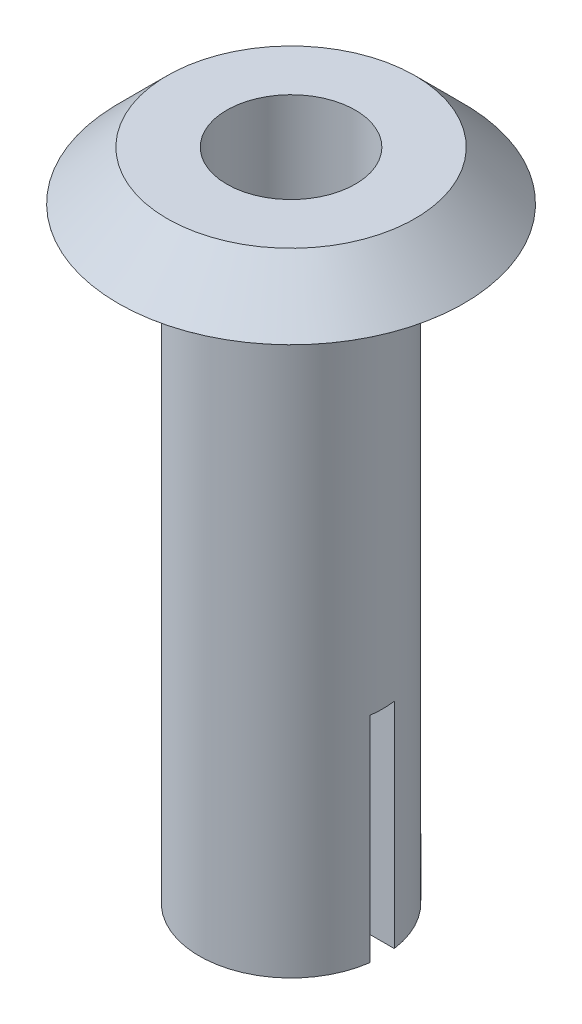
ISO-10303-21;
HEADER;
FILE_DESCRIPTION(('STEP AP214'),'2;1');
FILE_NAME('part.step','',(''),(''),'','','');
FILE_SCHEMA(('AUTOMOTIVE_DESIGN { 1 0 10303 214 1 1 1 1 }'));
ENDSEC;
DATA;
#1=APPLICATION_CONTEXT('core data for automotive mechanical design processes');
#2=APPLICATION_PROTOCOL_DEFINITION('international standard','automotive_design',2000,#1);
#3=PRODUCT_CONTEXT('',#1,'mechanical');
#4=PRODUCT('Part','Part','',(#3));
#5=PRODUCT_RELATED_PRODUCT_CATEGORY('part','',(#4));
#6=PRODUCT_DEFINITION_FORMATION('','',#4);
#7=PRODUCT_DEFINITION_CONTEXT('part definition',#1,'design');
#8=PRODUCT_DEFINITION('design','',#6,#7);
#9=PRODUCT_DEFINITION_SHAPE('','',#8);
#10=(LENGTH_UNIT() NAMED_UNIT(*) SI_UNIT(.MILLI.,.METRE.));
#11=(NAMED_UNIT(*) PLANE_ANGLE_UNIT() SI_UNIT($,.RADIAN.));
#12=(NAMED_UNIT(*) SI_UNIT($,.STERADIAN.) SOLID_ANGLE_UNIT());
#13=UNCERTAINTY_MEASURE_WITH_UNIT(LENGTH_MEASURE(1.E-05),#10,'distance_accuracy_value','');
#14=(GEOMETRIC_REPRESENTATION_CONTEXT(3) GLOBAL_UNCERTAINTY_ASSIGNED_CONTEXT((#13)) GLOBAL_UNIT_ASSIGNED_CONTEXT((#10,
#11,#12)) REPRESENTATION_CONTEXT('',''));
#15=CARTESIAN_POINT('',(0.,0.,0.));
#16=DIRECTION('',(0.,0.,1.));
#17=DIRECTION('',(1.,0.,0.));
#18=AXIS2_PLACEMENT_3D('',#15,#16,#17);
#19=CARTESIAN_POINT('',(0.,0.,0.));
#20=DIRECTION('',(0.,1.,0.));
#21=DIRECTION('',(0.,0.,1.));
#22=AXIS2_PLACEMENT_3D('',#19,#20,#21);
#23=PLANE('',#22);
#24=CARTESIAN_POINT('',(0.,0.,0.));
#25=DIRECTION('',(0.,1.,0.));
#26=DIRECTION('',(0.,0.,1.));
#27=AXIS2_PLACEMENT_3D('',#24,#25,#26);
#28=CIRCLE('',#27,1.5);
#29=CARTESIAN_POINT('',(1.48660687473185,0.,-0.2));
#30=VERTEX_POINT('',#29);
#31=CARTESIAN_POINT('',(-1.48660687473185,0.,-0.2));
#32=VERTEX_POINT('',#31);
#33=EDGE_CURVE('E128',#30,#32,#28,.T.);
#34=ORIENTED_EDGE('',*,*,#33,.F.);
#35=DIRECTION('',(1.,0.,0.));
#36=VECTOR('',#35,1.);
#37=CARTESIAN_POINT('',(-1.5,0.,-0.2));
#38=LINE('',#37,#36);
#39=EDGE_CURVE('E115',#32,#30,#38,.T.);
#40=ORIENTED_EDGE('',*,*,#39,.F.);
#41=EDGE_LOOP('',(#34,#40));
#42=FACE_BOUND('',#41,.T.);
#43=ADVANCED_FACE('F32',(#42),#23,.F.);
#44=CARTESIAN_POINT('',(0.,0.300099999999999,0.));
#45=DIRECTION('',(0.,1.,0.));
#46=DIRECTION('',(0.,0.,1.));
#47=AXIS2_PLACEMENT_3D('',#44,#45,#46);
#48=PLANE('',#47);
#49=DIRECTION('',(-1.,0.,0.));
#50=VECTOR('',#49,1.);
#51=CARTESIAN_POINT('',(0.,0.300099999999999,-0.2));
#52=LINE('',#51,#50);
#53=CARTESIAN_POINT('',(0.15,0.300099999999999,-0.2));
#54=VERTEX_POINT('',#53);
#55=CARTESIAN_POINT('',(-0.150000000000001,0.300099999999986,-0.2));
#56=VERTEX_POINT('',#55);
#57=EDGE_CURVE('E125',#54,#56,#52,.T.);
#58=ORIENTED_EDGE('',*,*,#57,.F.);
#59=CARTESIAN_POINT('',(0.,0.300099999999999,0.));
#60=DIRECTION('',(0.,1.,0.));
#61=DIRECTION('',(0.,0.,1.));
#62=AXIS2_PLACEMENT_3D('',#59,#60,#61);
#63=CIRCLE('',#62,0.25);
#64=EDGE_CURVE('E149',#54,#56,#63,.T.);
#65=ORIENTED_EDGE('',*,*,#64,.T.);
#66=EDGE_LOOP('',(#58,#65));
#67=FACE_BOUND('',#66,.T.);
#68=ADVANCED_FACE('F174',(#67),#48,.T.);
#69=CARTESIAN_POINT('',(0.,1.1001,0.));
#70=DIRECTION('',(0.,1.,0.));
#71=DIRECTION('',(0.,0.,1.));
#72=AXIS2_PLACEMENT_3D('',#69,#70,#71);
#73=DEGENERATE_TOROIDAL_SURFACE('',#72,0.25,0.8,.T.);
#74=ORIENTED_EDGE('',*,*,#64,.F.);
#75=CARTESIAN_POINT('',(0.,0.301664028866421,-0.2));
#76=CARTESIAN_POINT('',(0.0166698415826688,0.301665716670462,-0.2));
#77=CARTESIAN_POINT('',(0.0333398856129194,0.3015243846989,-0.2));
#78=CARTESIAN_POINT('',(0.0666781693266342,0.30108013124724,-0.2));
#79=CARTESIAN_POINT('',(0.0833464085193591,0.300777189443076,-0.2));
#80=CARTESIAN_POINT('',(0.1334092614839,0.300050609114223,-0.2));
#81=CARTESIAN_POINT('',(0.166812993914217,0.299810645876321,-0.2));
#82=CARTESIAN_POINT('',(0.229406412635807,0.301628464075076,-0.2));
#83=CARTESIAN_POINT('',(0.258601027229079,0.303402834124199,-0.2));
#84=CARTESIAN_POINT('',(0.316743266893158,0.309438387928073,-0.2));
#85=CARTESIAN_POINT('',(0.345690900061749,0.313699489829914,-0.2));
#86=CARTESIAN_POINT('',(0.402991969738191,0.324990979910246,-0.2));
#87=CARTESIAN_POINT('',(0.43134645596889,0.332015945335915,-0.2));
#88=CARTESIAN_POINT('',(0.487189985294854,0.348926444225662,-0.2));
#89=CARTESIAN_POINT('',(0.51467891698504,0.358812344263913,-0.2));
#90=CARTESIAN_POINT('',(0.583350982841369,0.387704578778115,-0.2));
#91=CARTESIAN_POINT('',(0.623707050723279,0.408732010133996,-0.2));
#92=CARTESIAN_POINT('',(0.70034544039585,0.457286962317908,-0.2));
#93=CARTESIAN_POINT('',(0.736623667136238,0.484820932590386,-0.2));
#94=CARTESIAN_POINT('',(0.803997133913799,0.54568309567333,-0.2));
#95=CARTESIAN_POINT('',(0.835088877571679,0.579015166498633,-0.2));
#96=CARTESIAN_POINT('',(0.891088036855366,0.650499827033321,-0.2));
#97=CARTESIAN_POINT('',(0.91599833710029,0.688650155675189,-0.2));
#98=CARTESIAN_POINT('',(0.958481280077041,0.767903473247014,-0.2));
#99=CARTESIAN_POINT('',(0.976184281869383,0.808936633314383,-0.2));
#100=CARTESIAN_POINT('',(1.00439993048064,0.893409146125019,-0.2));
#101=CARTESIAN_POINT('',(1.01491219899784,0.936848625333877,-0.2));
#102=CARTESIAN_POINT('',(1.02838751393651,1.02458296266082,-0.2));
#103=CARTESIAN_POINT('',(1.03140084062819,1.06887010627033,-0.2));
#104=CARTESIAN_POINT('',(1.02993685654376,1.15732453651702,-0.2));
#105=CARTESIAN_POINT('',(1.02545891825336,1.20149181280298,-0.2));
#106=CARTESIAN_POINT('',(1.00915342271604,1.28838340979925,-0.2));
#107=CARTESIAN_POINT('',(0.997336178055473,1.3311096666496,-0.2));
#108=CARTESIAN_POINT('',(0.96671324204589,1.41395512181443,-0.2));
#109=CARTESIAN_POINT('',(0.94791096556733,1.4540755828194,-0.2));
#110=CARTESIAN_POINT('',(0.903839144046234,1.5306506914578,-0.2));
#111=CARTESIAN_POINT('',(0.878562317198208,1.56710114677823,-0.2));
#112=CARTESIAN_POINT('',(0.822245470323173,1.63532842733279,-0.2));
#113=CARTESIAN_POINT('',(0.791196792082228,1.66709810098076,-0.2));
#114=CARTESIAN_POINT('',(0.724008067566469,1.72527142435174,-0.2));
#115=CARTESIAN_POINT('',(0.687830871368458,1.75163214192628,-0.2));
#116=CARTESIAN_POINT('',(0.611776285106589,1.7979354345787,-0.2));
#117=CARTESIAN_POINT('',(0.571913327608463,1.81790178231344,-0.2));
#118=CARTESIAN_POINT('',(0.488698905847722,1.85152795161462,-0.2));
#119=CARTESIAN_POINT('',(0.445293861557957,1.86505457212068,-0.2));
#120=CARTESIAN_POINT('',(0.356717442684082,1.88530811915976,-0.2));
#121=CARTESIAN_POINT('',(0.311537986720364,1.89199895064935,-0.2));
#122=CARTESIAN_POINT('',(0.243810832825528,1.89765746387715,-0.2));
#123=CARTESIAN_POINT('',(0.221405555467714,1.89882104800239,-0.2));
#124=CARTESIAN_POINT('',(0.176559166379535,1.90008848768721,-0.2));
#125=CARTESIAN_POINT('',(0.154118045261469,1.90019199329407,-0.2));
#126=CARTESIAN_POINT('',(0.109196727516647,1.89986873007227,-0.2));
#127=CARTESIAN_POINT('',(0.0867165534580952,1.89944079485711,-0.2));
#128=CARTESIAN_POINT('',(0.0417602725450973,1.89876428051567,-0.2));
#129=CARTESIAN_POINT('',(0.019284167584967,1.89851563069695,-0.2));
#130=CARTESIAN_POINT('',(-0.025660278519589,1.8985594930865,-0.2));
#131=CARTESIAN_POINT('',(-0.0481286199316124,1.89885183940198,-0.2));
#132=CARTESIAN_POINT('',(-0.0930716344119246,1.89955118293042,-0.2));
#133=CARTESIAN_POINT('',(-0.115546306170629,1.89995822829499,-0.2));
#134=CARTESIAN_POINT('',(-0.160455392283716,1.90018035007007,-0.2));
#135=CARTESIAN_POINT('',(-0.182889787694872,1.89999671397185,-0.2));
#136=CARTESIAN_POINT('',(-0.227717260508836,1.89852636404797,-0.2));
#137=CARTESIAN_POINT('',(-0.250110352920595,1.89724019939141,-0.2));
#138=CARTESIAN_POINT('',(-0.296297968778292,1.89312072295697,-0.2));
#139=CARTESIAN_POINT('',(-0.320084183523527,1.89018810205309,-0.2));
#140=CARTESIAN_POINT('',(-0.367381071661445,1.88251258442502,-0.2));
#141=CARTESIAN_POINT('',(-0.390891486534653,1.87776811045488,-0.2));
#142=CARTESIAN_POINT('',(-0.460460798783883,1.86072186606951,-0.2));
#143=CARTESIAN_POINT('',(-0.50586933742622,1.84558316011647,-0.2));
#144=CARTESIAN_POINT('',(-0.593621321286191,1.80758337797835,-0.2));
#145=CARTESIAN_POINT('',(-0.635946841713136,1.78468093791962,-0.2));
#146=CARTESIAN_POINT('',(-0.716023573084661,1.73160345969393,-0.2));
#147=CARTESIAN_POINT('',(-0.753756166231605,1.70140021266384,-0.2));
#148=CARTESIAN_POINT('',(-0.82122693284102,1.63652498131007,-0.2));
#149=CARTESIAN_POINT('',(-0.85129133705298,1.60219152148355,-0.2));
#150=CARTESIAN_POINT('',(-0.905034875406046,1.52893181931438,-0.2));
#151=CARTESIAN_POINT('',(-0.928725093673388,1.49001372097015,-0.2));
#152=CARTESIAN_POINT('',(-0.968651849943626,1.40950280684566,-0.2));
#153=CARTESIAN_POINT('',(-0.985028556964881,1.3679794247673,-0.2));
#154=CARTESIAN_POINT('',(-1.01053977879569,1.28274183353331,-0.2));
#155=CARTESIAN_POINT('',(-1.01967100083736,1.23902663787444,-0.2));
#156=CARTESIAN_POINT('',(-1.03037488252278,1.15095439400306,-0.2));
#157=CARTESIAN_POINT('',(-1.0319936625118,1.10660294352136,-0.2));
#158=CARTESIAN_POINT('',(-1.02775164201873,1.01826517229983,-0.2));
#159=CARTESIAN_POINT('',(-1.0218918980028,0.974278800869947,-0.2));
#160=CARTESIAN_POINT('',(-1.00287715257568,0.887968733763957,-0.2));
#161=CARTESIAN_POINT('',(-0.989730984078273,0.845643091273803,-0.2));
#162=CARTESIAN_POINT('',(-0.956532739392012,0.763794250976399,-0.2));
#163=CARTESIAN_POINT('',(-0.936480727484413,0.724271027087691,-0.2));
#164=CARTESIAN_POINT('',(-0.89000930653147,0.64906071693307,-0.2));
#165=CARTESIAN_POINT('',(-0.863577783044371,0.613381118268823,-0.2));
#166=CARTESIAN_POINT('',(-0.805135950061446,0.546924767249335,-0.2));
#167=CARTESIAN_POINT('',(-0.773124960237336,0.516148613669176,-0.2));
#168=CARTESIAN_POINT('',(-0.704201964591778,0.460112519291118,-0.2));
#169=CARTESIAN_POINT('',(-0.667255690928788,0.434894751164043,-0.2));
#170=CARTESIAN_POINT('',(-0.589750741014979,0.390878049049808,-0.2));
#171=CARTESIAN_POINT('',(-0.54919335423805,0.372076835306597,-0.2));
#172=CARTESIAN_POINT('',(-0.464618124035503,0.340825065662164,-0.2));
#173=CARTESIAN_POINT('',(-0.420541481173459,0.328533559765889,-0.2));
#174=CARTESIAN_POINT('',(-0.353478204694672,0.315193747108826,-0.2));
#175=CARTESIAN_POINT('',(-0.330958738023759,0.31159639946551,-0.2));
#176=CARTESIAN_POINT('',(-0.285725184481576,0.305962984516719,-0.2));
#177=CARTESIAN_POINT('',(-0.263011112275252,0.303926800594549,-0.2));
#178=CARTESIAN_POINT('',(-0.220265046414644,0.301347040853376,-0.2));
#179=CARTESIAN_POINT('',(-0.200241187409336,0.300652632368691,-0.2));
#180=CARTESIAN_POINT('',(-0.160181956336416,0.300008909417066,-0.2));
#181=CARTESIAN_POINT('',(-0.140146582936294,0.300059714626491,-0.2));
#182=CARTESIAN_POINT('',(-0.100092386262173,0.300488954065012,-0.2));
#183=CARTESIAN_POINT('',(-0.0800735597774633,0.300867219654249,-0.2));
#184=CARTESIAN_POINT('',(-0.040036585659352,0.301453725364676,-0.2));
#185=CARTESIAN_POINT('',(-0.0200184388052064,0.301662002020409,-0.2));
#186=CARTESIAN_POINT('',(0.,0.301664028866421,-0.2));
#187=B_SPLINE_CURVE_WITH_KNOTS('',3,(#75,#76,#77,#78,#79,#80,#81,#82,#83,#84,#85,#86,#87,#88,
#89,#90,#91,#92,#93,#94,#95,#96,#97,#98,#99,#100,#101,#102,#103,#104,#105,#106,#107,#108,#109,
#110,#111,#112,#113,#114,#115,#116,#117,#118,#119,#120,#121,#122,#123,#124,#125,#126,#127,#128,
#129,#130,#131,#132,#133,#134,#135,#136,#137,#138,#139,#140,#141,#142,#143,#144,#145,#146,#147,
#148,#149,#150,#151,#152,#153,#154,#155,#156,#157,#158,#159,#160,#161,#162,#163,#164,#165,#166,
#167,#168,#169,#170,#171,#172,#173,#174,#175,#176,#177,#178,#179,#180,#181,#182,#183,#184,#185,
#186),.UNSPECIFIED.,.T.,.F.,(4,2,2,2,2,2,2,2,2,2,2,2,2,2,2,2,2,2,2,2,2,2,2,2,2,2,2,2,2,2,2,2,2,
2,2,2,2,2,2,2,2,2,2,2,2,2,2,2,2,2,2,2,2,2,2,4),(0.,0.0500092875870138,0.100024865829181,
0.200203184706985,0.287861777597849,0.375517485293757,0.463002061677427,0.550497852506859,
0.686345267481207,0.822327906861565,0.958401849368154,1.09441217197756,1.22783965644739,
1.36127415994634,1.49381154741136,1.62636003757694,1.75872270162411,1.8910207406544,
2.02346823117991,2.15611603011066,2.28977910205329,2.42293931893524,2.55874556687355,
2.69526526367023,2.76254952674017,2.82985600094964,2.89731045831805,2.96473830375305,
3.03214547632458,3.09958098925381,3.16686961463669,3.23412474304008,3.3059556878525,
3.37784930567182,3.52070973803225,3.66434359216108,3.80854154820458,3.94478310926737,
4.08078620473341,4.21405728780716,4.34738890234448,4.4799008756818,4.61239413156609,
4.74472712366483,4.87705888400943,5.00964394211279,5.14224517820572,5.27582027582979,
5.40934786564634,5.54600276763964,5.6143717931752,5.68273571114481,5.74282493822376,
5.80292381533889,5.86299176034259,5.92304679195689),.UNSPECIFIED.);
#188=CARTESIAN_POINT('',(1.03077640640442,1.1001,-0.2));
#189=VERTEX_POINT('',#188);
#190=EDGE_CURVE('E250',#54,#189,#187,.T.);
#191=ORIENTED_EDGE('',*,*,#190,.T.);
#192=CARTESIAN_POINT('',(0.,1.1001,0.));
#193=DIRECTION('',(0.,1.,0.));
#194=DIRECTION('',(0.,0.,1.));
#195=AXIS2_PLACEMENT_3D('',#192,#193,#194);
#196=CIRCLE('',#195,1.05);
#197=CARTESIAN_POINT('',(-1.03077640641938,1.10010000000522,-0.2));
#198=VERTEX_POINT('',#197);
#199=EDGE_CURVE('E153',#198,#189,#196,.F.);
#200=ORIENTED_EDGE('',*,*,#199,.F.);
#201=EDGE_CURVE('E159',#198,#56,#187,.T.);
#202=ORIENTED_EDGE('',*,*,#201,.T.);
#203=EDGE_LOOP('',(#74,#191,#200,#202));
#204=FACE_BOUND('',#203,.T.);
#205=ADVANCED_FACE('F194',(#204),#73,.F.);
#206=CARTESIAN_POINT('',(0.,10.7,0.));
#207=DIRECTION('',(0.,-1.,0.));
#208=DIRECTION('',(0.,0.,-1.));
#209=AXIS2_PLACEMENT_3D('',#206,#207,#208);
#210=CYLINDRICAL_SURFACE('',#209,1.5);
#211=CARTESIAN_POINT('',(0.,3.5,0.));
#212=DIRECTION('',(0.,-1.,0.));
#213=DIRECTION('',(0.,0.,-1.));
#214=AXIS2_PLACEMENT_3D('',#211,#212,#213);
#215=CIRCLE('',#214,1.5);
#216=CARTESIAN_POINT('',(1.48660687473185,3.5,-0.2));
#217=VERTEX_POINT('',#216);
#218=CARTESIAN_POINT('',(1.48660687473185,3.5,0.2));
#219=VERTEX_POINT('',#218);
#220=EDGE_CURVE('E212',#217,#219,#215,.T.);
#221=ORIENTED_EDGE('',*,*,#220,.F.);
#222=DIRECTION('',(0.,-1.,0.));
#223=VECTOR('',#222,1.);
#224=CARTESIAN_POINT('',(1.48660687473185,10.7,-0.2));
#225=LINE('',#224,#223);
#226=EDGE_CURVE('E211',#217,#30,#225,.T.);
#227=ORIENTED_EDGE('',*,*,#226,.T.);
#228=ORIENTED_EDGE('',*,*,#33,.T.);
#229=DIRECTION('',(0.,-1.,0.));
#230=VECTOR('',#229,1.);
#231=CARTESIAN_POINT('',(-1.48660687473185,10.7,-0.2));
#232=LINE('',#231,#230);
#233=CARTESIAN_POINT('',(-1.48660687473185,3.5,-0.2));
#234=VERTEX_POINT('',#233);
#235=EDGE_CURVE('E210',#32,#234,#232,.F.);
#236=ORIENTED_EDGE('',*,*,#235,.T.);
#237=CARTESIAN_POINT('',(-1.48660687473185,3.5,0.2));
#238=VERTEX_POINT('',#237);
#239=EDGE_CURVE('E124',#238,#234,#215,.T.);
#240=ORIENTED_EDGE('',*,*,#239,.F.);
#241=DIRECTION('',(0.,-1.,0.));
#242=VECTOR('',#241,1.);
#243=CARTESIAN_POINT('',(-1.48660687473185,10.7,0.2));
#244=LINE('',#243,#242);
#245=CARTESIAN_POINT('',(-1.48660687473185,0.,0.2));
#246=VERTEX_POINT('',#245);
#247=EDGE_CURVE('E110',#238,#246,#244,.T.);
#248=ORIENTED_EDGE('',*,*,#247,.T.);
#249=CARTESIAN_POINT('',(1.48660687473185,0.,0.2));
#250=VERTEX_POINT('',#249);
#251=EDGE_CURVE('E122',#246,#250,#28,.T.);
#252=ORIENTED_EDGE('',*,*,#251,.T.);
#253=DIRECTION('',(0.,-1.,0.));
#254=VECTOR('',#253,1.);
#255=CARTESIAN_POINT('',(1.48660687473185,10.7,0.2));
#256=LINE('',#255,#254);
#257=EDGE_CURVE('E48',#250,#219,#256,.F.);
#258=ORIENTED_EDGE('',*,*,#257,.T.);
#259=EDGE_LOOP('',(#221,#227,#228,#236,#240,#248,#252,#258));
#260=FACE_BOUND('',#259,.T.);
#261=CARTESIAN_POINT('',(0.,9.9,0.));
#262=DIRECTION('',(0.,1.,0.));
#263=DIRECTION('',(0.,0.,1.));
#264=AXIS2_PLACEMENT_3D('',#261,#262,#263);
#265=CIRCLE('',#264,1.5);
#266=CARTESIAN_POINT('',(0.,9.9,1.5));
#267=VERTEX_POINT('',#266);
#268=EDGE_CURVE('E132',#267,#267,#265,.T.);
#269=ORIENTED_EDGE('',*,*,#268,.F.);
#270=EDGE_LOOP('',(#269));
#271=FACE_BOUND('',#270,.T.);
#272=ADVANCED_FACE('F120',(#260,#271),#210,.T.);
#273=ORIENTED_EDGE('',*,*,#251,.F.);
#274=DIRECTION('',(-1.,0.,0.));
#275=VECTOR('',#274,1.);
#276=CARTESIAN_POINT('',(-1.5,0.,0.2));
#277=LINE('',#276,#275);
#278=EDGE_CURVE('E106',#250,#246,#277,.T.);
#279=ORIENTED_EDGE('',*,*,#278,.F.);
#280=EDGE_LOOP('',(#273,#279));
#281=FACE_BOUND('',#280,.T.);
#282=ADVANCED_FACE('F127',(#281),#23,.F.);
#283=CARTESIAN_POINT('',(0.,9.9,0.));
#284=DIRECTION('',(0.,1.,0.));
#285=DIRECTION('',(0.,0.,1.));
#286=AXIS2_PLACEMENT_3D('',#283,#284,#285);
#287=PLANE('',#286);
#288=CARTESIAN_POINT('',(0.,9.9,0.));
#289=DIRECTION('',(0.,1.,0.));
#290=DIRECTION('',(0.,0.,1.));
#291=AXIS2_PLACEMENT_3D('',#288,#289,#290);
#292=CIRCLE('',#291,2.825);
#293=CARTESIAN_POINT('',(0.,9.9,2.825));
#294=VERTEX_POINT('',#293);
#295=EDGE_CURVE('E129',#294,#294,#292,.T.);
#296=ORIENTED_EDGE('',*,*,#295,.F.);
#297=EDGE_LOOP('',(#296));
#298=FACE_BOUND('',#297,.T.);
#299=ORIENTED_EDGE('',*,*,#268,.T.);
#300=EDGE_LOOP('',(#299));
#301=FACE_BOUND('',#300,.T.);
#302=ADVANCED_FACE('F184',(#298,#301),#287,.F.);
#303=CARTESIAN_POINT('',(0.,9.9,0.));
#304=DIRECTION('',(0.,1.,0.));
#305=DIRECTION('',(0.,0.,1.));
#306=AXIS2_PLACEMENT_3D('',#303,#304,#305);
#307=CYLINDRICAL_SURFACE('',#306,2.825);
#308=CARTESIAN_POINT('',(0.,9.90009999999999,0.));
#309=DIRECTION('',(0.,1.,0.));
#310=DIRECTION('',(0.,0.,1.));
#311=AXIS2_PLACEMENT_3D('',#308,#309,#310);
#312=CIRCLE('',#311,2.825);
#313=CARTESIAN_POINT('',(0.,9.90009999999999,2.825));
#314=VERTEX_POINT('',#313);
#315=EDGE_CURVE('E143',#314,#314,#312,.F.);
#316=ORIENTED_EDGE('',*,*,#315,.T.);
#317=EDGE_LOOP('',(#316));
#318=FACE_BOUND('',#317,.T.);
#319=ORIENTED_EDGE('',*,*,#295,.T.);
#320=EDGE_LOOP('',(#319));
#321=FACE_BOUND('',#320,.T.);
#322=ADVANCED_FACE('F182',(#318,#321),#307,.T.);
#323=CARTESIAN_POINT('',(0.,10.7001,0.));
#324=DIRECTION('',(0.,1.,0.));
#325=DIRECTION('',(0.,0.,1.));
#326=AXIS2_PLACEMENT_3D('',#323,#324,#325);
#327=PLANE('',#326);
#328=CARTESIAN_POINT('',(0.,10.7001,0.));
#329=DIRECTION('',(0.,1.,0.));
#330=DIRECTION('',(0.,0.,1.));
#331=AXIS2_PLACEMENT_3D('',#328,#329,#330);
#332=CIRCLE('',#331,1.05);
#333=CARTESIAN_POINT('',(0.,10.7001,1.05));
#334=VERTEX_POINT('',#333);
#335=EDGE_CURVE('E134',#334,#334,#332,.T.);
#336=ORIENTED_EDGE('',*,*,#335,.F.);
#337=EDGE_LOOP('',(#336));
#338=FACE_BOUND('',#337,.T.);
#339=CARTESIAN_POINT('',(0.,10.7001,0.));
#340=DIRECTION('',(0.,1.,0.));
#341=DIRECTION('',(0.,0.,1.));
#342=AXIS2_PLACEMENT_3D('',#339,#340,#341);
#343=CIRCLE('',#342,2.025);
#344=CARTESIAN_POINT('',(0.,10.7001,2.025));
#345=VERTEX_POINT('',#344);
#346=EDGE_CURVE('E140',#345,#345,#343,.T.);
#347=ORIENTED_EDGE('',*,*,#346,.T.);
#348=EDGE_LOOP('',(#347));
#349=FACE_BOUND('',#348,.T.);
#350=ADVANCED_FACE('F179',(#338,#349),#327,.T.);
#351=CARTESIAN_POINT('',(0.,10.7001,0.));
#352=DIRECTION('',(0.,-1.,0.));
#353=DIRECTION('',(0.,0.,-1.));
#354=AXIS2_PLACEMENT_3D('',#351,#352,#353);
#355=CONICAL_SURFACE('',#354,2.025,0.785398163397447);
#356=ORIENTED_EDGE('',*,*,#315,.F.);
#357=EDGE_LOOP('',(#356));
#358=FACE_BOUND('',#357,.T.);
#359=ORIENTED_EDGE('',*,*,#346,.F.);
#360=EDGE_LOOP('',(#359));
#361=FACE_BOUND('',#360,.T.);
#362=ADVANCED_FACE('F177',(#358,#361),#355,.T.);
#363=CARTESIAN_POINT('',(0.,0.300099999999999,0.));
#364=DIRECTION('',(0.,1.,0.));
#365=DIRECTION('',(0.,0.,1.));
#366=AXIS2_PLACEMENT_3D('',#363,#364,#365);
#367=CYLINDRICAL_SURFACE('',#366,1.05);
#368=CARTESIAN_POINT('',(0.,3.5,0.));
#369=DIRECTION('',(0.,-1.,0.));
#370=DIRECTION('',(0.,0.,-1.));
#371=AXIS2_PLACEMENT_3D('',#368,#369,#370);
#372=CIRCLE('',#371,1.05);
#373=CARTESIAN_POINT('',(-1.03077640640442,3.5,-0.2));
#374=VERTEX_POINT('',#373);
#375=CARTESIAN_POINT('',(-1.03077640640442,3.5,0.2));
#376=VERTEX_POINT('',#375);
#377=EDGE_CURVE('E11',#374,#376,#372,.F.);
#378=ORIENTED_EDGE('',*,*,#377,.F.);
#379=DIRECTION('',(0.,1.,0.));
#380=VECTOR('',#379,1.);
#381=CARTESIAN_POINT('',(-1.03077640640442,0.300099999999999,-0.2));
#382=LINE('',#381,#380);
#383=EDGE_CURVE('E243',#374,#198,#382,.F.);
#384=ORIENTED_EDGE('',*,*,#383,.T.);
#385=ORIENTED_EDGE('',*,*,#199,.T.);
#386=DIRECTION('',(0.,1.,0.));
#387=VECTOR('',#386,1.);
#388=CARTESIAN_POINT('',(1.03077640640442,0.300099999999999,-0.2));
#389=LINE('',#388,#387);
#390=CARTESIAN_POINT('',(1.03077640640442,3.5,-0.2));
#391=VERTEX_POINT('',#390);
#392=EDGE_CURVE('E218',#189,#391,#389,.T.);
#393=ORIENTED_EDGE('',*,*,#392,.T.);
#394=CARTESIAN_POINT('',(1.03077640640442,3.5,0.2));
#395=VERTEX_POINT('',#394);
#396=EDGE_CURVE('E37',#395,#391,#372,.F.);
#397=ORIENTED_EDGE('',*,*,#396,.F.);
#398=DIRECTION('',(0.,1.,0.));
#399=VECTOR('',#398,1.);
#400=CARTESIAN_POINT('',(1.03077640640442,0.300099999999999,0.2));
#401=LINE('',#400,#399);
#402=CARTESIAN_POINT('',(1.03077640641938,1.10010000000522,0.2));
#403=VERTEX_POINT('',#402);
#404=EDGE_CURVE('E233',#395,#403,#401,.F.);
#405=ORIENTED_EDGE('',*,*,#404,.T.);
#406=CARTESIAN_POINT('',(-1.03077640640442,1.1001,0.2));
#407=VERTEX_POINT('',#406);
#408=EDGE_CURVE('E150',#403,#407,#196,.F.);
#409=ORIENTED_EDGE('',*,*,#408,.T.);
#410=DIRECTION('',(0.,1.,0.));
#411=VECTOR('',#410,1.);
#412=CARTESIAN_POINT('',(-1.03077640640442,0.300099999999999,0.2));
#413=LINE('',#412,#411);
#414=EDGE_CURVE('E236',#407,#376,#413,.T.);
#415=ORIENTED_EDGE('',*,*,#414,.T.);
#416=EDGE_LOOP('',(#378,#384,#385,#393,#397,#405,#409,#415));
#417=FACE_BOUND('',#416,.T.);
#418=ORIENTED_EDGE('',*,*,#335,.T.);
#419=EDGE_LOOP('',(#418));
#420=FACE_BOUND('',#419,.T.);
#421=ADVANCED_FACE('F172',(#417,#420),#367,.F.);
#422=DIRECTION('',(1.,0.,0.));
#423=VECTOR('',#422,1.);
#424=CARTESIAN_POINT('',(0.,0.300099999999999,0.2));
#425=LINE('',#424,#423);
#426=CARTESIAN_POINT('',(-0.15,0.300099999999999,0.2));
#427=VERTEX_POINT('',#426);
#428=CARTESIAN_POINT('',(0.15,0.300099999999999,0.2));
#429=VERTEX_POINT('',#428);
#430=EDGE_CURVE('E55',#427,#429,#425,.T.);
#431=ORIENTED_EDGE('',*,*,#430,.F.);
#432=EDGE_CURVE('E146',#427,#429,#63,.T.);
#433=ORIENTED_EDGE('',*,*,#432,.T.);
#434=EDGE_LOOP('',(#431,#433));
#435=FACE_BOUND('',#434,.T.);
#436=ADVANCED_FACE('F169',(#435),#48,.T.);
#437=ORIENTED_EDGE('',*,*,#432,.F.);
#438=CARTESIAN_POINT('',(0.,0.301664028866421,0.2));
#439=CARTESIAN_POINT('',(-0.0166698415826688,0.301665716670462,0.2));
#440=CARTESIAN_POINT('',(-0.0333398856129194,0.3015243846989,0.2));
#441=CARTESIAN_POINT('',(-0.0666781693266342,0.30108013124724,0.2));
#442=CARTESIAN_POINT('',(-0.0833464085193591,0.300777189443076,0.2));
#443=CARTESIAN_POINT('',(-0.1334092614839,0.300050609114223,0.2));
#444=CARTESIAN_POINT('',(-0.166812993914217,0.299810645876321,0.2));
#445=CARTESIAN_POINT('',(-0.229406412635807,0.301628464075076,0.2));
#446=CARTESIAN_POINT('',(-0.258601027229079,0.303402834124199,0.2));
#447=CARTESIAN_POINT('',(-0.316743266893158,0.309438387928073,0.2));
#448=CARTESIAN_POINT('',(-0.345690900061749,0.313699489829914,0.2));
#449=CARTESIAN_POINT('',(-0.402991969738191,0.324990979910246,0.2));
#450=CARTESIAN_POINT('',(-0.43134645596889,0.332015945335915,0.2));
#451=CARTESIAN_POINT('',(-0.487189985294854,0.348926444225662,0.2));
#452=CARTESIAN_POINT('',(-0.51467891698504,0.358812344263913,0.2));
#453=CARTESIAN_POINT('',(-0.583350982841369,0.387704578778115,0.2));
#454=CARTESIAN_POINT('',(-0.623707050723279,0.408732010133996,0.2));
#455=CARTESIAN_POINT('',(-0.70034544039585,0.457286962317908,0.2));
#456=CARTESIAN_POINT('',(-0.736623667136238,0.484820932590386,0.2));
#457=CARTESIAN_POINT('',(-0.803997133913799,0.54568309567333,0.2));
#458=CARTESIAN_POINT('',(-0.835088877571679,0.579015166498633,0.2));
#459=CARTESIAN_POINT('',(-0.891088036855365,0.650499827033321,0.2));
#460=CARTESIAN_POINT('',(-0.91599833710029,0.688650155675189,0.2));
#461=CARTESIAN_POINT('',(-0.958481280077041,0.767903473247014,0.2));
#462=CARTESIAN_POINT('',(-0.976184281869382,0.808936633314382,0.2));
#463=CARTESIAN_POINT('',(-1.00439993048064,0.893409146125019,0.2));
#464=CARTESIAN_POINT('',(-1.01491219899784,0.936848625333876,0.2));
#465=CARTESIAN_POINT('',(-1.02838751393651,1.02458296266082,0.2));
#466=CARTESIAN_POINT('',(-1.03140084062819,1.06887010627033,0.2));
#467=CARTESIAN_POINT('',(-1.02993685654376,1.15732453651702,0.2));
#468=CARTESIAN_POINT('',(-1.02545891825336,1.20149181280298,0.2));
#469=CARTESIAN_POINT('',(-1.00915342271604,1.28838340979925,0.2));
#470=CARTESIAN_POINT('',(-0.997336178055473,1.3311096666496,0.2));
#471=CARTESIAN_POINT('',(-0.966713242045891,1.41395512181443,0.2));
#472=CARTESIAN_POINT('',(-0.94791096556733,1.4540755828194,0.2));
#473=CARTESIAN_POINT('',(-0.903839144046234,1.5306506914578,0.2));
#474=CARTESIAN_POINT('',(-0.878562317198208,1.56710114677823,0.2));
#475=CARTESIAN_POINT('',(-0.822245470323173,1.63532842733279,0.2));
#476=CARTESIAN_POINT('',(-0.791196792082228,1.66709810098076,0.2));
#477=CARTESIAN_POINT('',(-0.724008067566469,1.72527142435174,0.2));
#478=CARTESIAN_POINT('',(-0.687830871368458,1.75163214192628,0.2));
#479=CARTESIAN_POINT('',(-0.611776285106589,1.7979354345787,0.2));
#480=CARTESIAN_POINT('',(-0.571913327608463,1.81790178231344,0.2));
#481=CARTESIAN_POINT('',(-0.488698905847723,1.85152795161462,0.2));
#482=CARTESIAN_POINT('',(-0.445293861557957,1.86505457212068,0.2));
#483=CARTESIAN_POINT('',(-0.356717442684082,1.88530811915976,0.2));
#484=CARTESIAN_POINT('',(-0.311537986720364,1.89199895064935,0.2));
#485=CARTESIAN_POINT('',(-0.243810832825528,1.89765746387715,0.2));
#486=CARTESIAN_POINT('',(-0.221405555467714,1.89882104800239,0.2));
#487=CARTESIAN_POINT('',(-0.176559166379535,1.90008848768721,0.2));
#488=CARTESIAN_POINT('',(-0.154118045261469,1.90019199329407,0.2));
#489=CARTESIAN_POINT('',(-0.109196727516647,1.89986873007227,0.2));
#490=CARTESIAN_POINT('',(-0.0867165534580954,1.89944079485711,0.2));
#491=CARTESIAN_POINT('',(-0.0417602725450975,1.89876428051567,0.2));
#492=CARTESIAN_POINT('',(-0.0192841675849671,1.89851563069695,0.2));
#493=CARTESIAN_POINT('',(0.0256602785195887,1.8985594930865,0.2));
#494=CARTESIAN_POINT('',(0.048128619931612,1.89885183940198,0.2));
#495=CARTESIAN_POINT('',(0.0930716344119241,1.89955118293042,0.2));
#496=CARTESIAN_POINT('',(0.115546306170629,1.89995822829499,0.2));
#497=CARTESIAN_POINT('',(0.160455392283716,1.90018035007007,0.2));
#498=CARTESIAN_POINT('',(0.182889787694872,1.89999671397185,0.2));
#499=CARTESIAN_POINT('',(0.227717260508836,1.89852636404797,0.2));
#500=CARTESIAN_POINT('',(0.250110352920594,1.89724019939141,0.2));
#501=CARTESIAN_POINT('',(0.296297968778291,1.89312072295697,0.2));
#502=CARTESIAN_POINT('',(0.320084183523527,1.89018810205309,0.2));
#503=CARTESIAN_POINT('',(0.367381071661445,1.88251258442502,0.2));
#504=CARTESIAN_POINT('',(0.390891486534653,1.87776811045488,0.2));
#505=CARTESIAN_POINT('',(0.460460798783882,1.86072186606951,0.2));
#506=CARTESIAN_POINT('',(0.505869337426219,1.84558316011647,0.2));
#507=CARTESIAN_POINT('',(0.59362132128619,1.80758337797835,0.2));
#508=CARTESIAN_POINT('',(0.635946841713135,1.78468093791962,0.2));
#509=CARTESIAN_POINT('',(0.716023573084661,1.73160345969393,0.2));
#510=CARTESIAN_POINT('',(0.753756166231605,1.70140021266385,0.2));
#511=CARTESIAN_POINT('',(0.821226932841019,1.63652498131007,0.2));
#512=CARTESIAN_POINT('',(0.851291337052979,1.60219152148355,0.2));
#513=CARTESIAN_POINT('',(0.905034875406045,1.52893181931438,0.2));
#514=CARTESIAN_POINT('',(0.928725093673388,1.49001372097015,0.2));
#515=CARTESIAN_POINT('',(0.968651849943626,1.40950280684566,0.2));
#516=CARTESIAN_POINT('',(0.98502855696488,1.3679794247673,0.2));
#517=CARTESIAN_POINT('',(1.01053977879569,1.28274183353331,0.2));
#518=CARTESIAN_POINT('',(1.01967100083736,1.23902663787444,0.2));
#519=CARTESIAN_POINT('',(1.03037488252278,1.15095439400307,0.2));
#520=CARTESIAN_POINT('',(1.0319936625118,1.10660294352136,0.2));
#521=CARTESIAN_POINT('',(1.02775164201873,1.01826517229983,0.2));
#522=CARTESIAN_POINT('',(1.0218918980028,0.974278800869948,0.2));
#523=CARTESIAN_POINT('',(1.00287715257568,0.887968733763958,0.2));
#524=CARTESIAN_POINT('',(0.989730984078273,0.845643091273803,0.2));
#525=CARTESIAN_POINT('',(0.956532739392012,0.7637942509764,0.2));
#526=CARTESIAN_POINT('',(0.936480727484414,0.724271027087692,0.2));
#527=CARTESIAN_POINT('',(0.890009306531471,0.649060716933071,0.2));
#528=CARTESIAN_POINT('',(0.863577783044371,0.613381118268824,0.2));
#529=CARTESIAN_POINT('',(0.805135950061446,0.546924767249335,0.2));
#530=CARTESIAN_POINT('',(0.773124960237337,0.516148613669177,0.2));
#531=CARTESIAN_POINT('',(0.704201964591779,0.460112519291119,0.2));
#532=CARTESIAN_POINT('',(0.667255690928789,0.434894751164043,0.2));
#533=CARTESIAN_POINT('',(0.58975074101498,0.390878049049809,0.2));
#534=CARTESIAN_POINT('',(0.549193354238051,0.372076835306598,0.2));
#535=CARTESIAN_POINT('',(0.464618124035504,0.340825065662164,0.2));
#536=CARTESIAN_POINT('',(0.42054148117346,0.328533559765889,0.2));
#537=CARTESIAN_POINT('',(0.353478204694672,0.315193747108826,0.2));
#538=CARTESIAN_POINT('',(0.33095873802376,0.311596399465511,0.2));
#539=CARTESIAN_POINT('',(0.285725184481577,0.305962984516719,0.2));
#540=CARTESIAN_POINT('',(0.263011112275253,0.303926800594549,0.2));
#541=CARTESIAN_POINT('',(0.220265046414645,0.301347040853376,0.2));
#542=CARTESIAN_POINT('',(0.200241187409338,0.300652632368692,0.2));
#543=CARTESIAN_POINT('',(0.160181956336418,0.300008909417066,0.2));
#544=CARTESIAN_POINT('',(0.140146582936295,0.300059714626491,0.2));
#545=CARTESIAN_POINT('',(0.100092386262173,0.300488954065012,0.2));
#546=CARTESIAN_POINT('',(0.0800735597774637,0.300867219654249,0.2));
#547=CARTESIAN_POINT('',(0.0400365856593522,0.301453725364676,0.2));
#548=CARTESIAN_POINT('',(0.0200184388052065,0.301662002020409,0.2));
#549=CARTESIAN_POINT('',(0.,0.301664028866421,0.2));
#550=B_SPLINE_CURVE_WITH_KNOTS('',3,(#438,#439,#440,#441,#442,#443,#444,#445,#446,#447,#448,
#449,#450,#451,#452,#453,#454,#455,#456,#457,#458,#459,#460,#461,#462,#463,#464,#465,#466,#467,
#468,#469,#470,#471,#472,#473,#474,#475,#476,#477,#478,#479,#480,#481,#482,#483,#484,#485,#486,
#487,#488,#489,#490,#491,#492,#493,#494,#495,#496,#497,#498,#499,#500,#501,#502,#503,#504,#505,
#506,#507,#508,#509,#510,#511,#512,#513,#514,#515,#516,#517,#518,#519,#520,#521,#522,#523,#524,
#525,#526,#527,#528,#529,#530,#531,#532,#533,#534,#535,#536,#537,#538,#539,#540,#541,#542,#543,
#544,#545,#546,#547,#548,#549),.UNSPECIFIED.,.T.,.F.,(4,2,2,2,2,2,2,2,2,2,2,2,2,2,2,2,2,2,2,2,2,
2,2,2,2,2,2,2,2,2,2,2,2,2,2,2,2,2,2,2,2,2,2,2,2,2,2,2,2,2,2,2,2,2,2,4),(0.,0.0500092875870138,
0.100024865829181,0.200203184706985,0.287861777597849,0.375517485293757,0.463002061677427,
0.550497852506859,0.686345267481206,0.822327906861565,0.958401849368153,1.09441217197756,
1.22783965644739,1.36127415994634,1.49381154741136,1.62636003757694,1.75872270162411,
1.8910207406544,2.02346823117991,2.15611603011066,2.28977910205329,2.42293931893524,
2.55874556687355,2.69526526367023,2.76254952674017,2.82985600094964,2.89731045831805,
2.96473830375306,3.03214547632458,3.09958098925381,3.16686961463669,3.23412474304008,
3.3059556878525,3.37784930567182,3.52070973803225,3.66434359216108,3.80854154820458,
3.94478310926737,4.08078620473341,4.21405728780716,4.34738890234448,4.4799008756818,
4.61239413156609,4.74472712366483,4.87705888400943,5.00964394211279,5.14224517820572,
5.27582027582979,5.40934786564635,5.54600276763964,5.6143717931752,5.68273571114481,
5.74282493822376,5.80292381533889,5.8629917603426,5.9230467919569),.UNSPECIFIED.);
#551=EDGE_CURVE('E158',#427,#407,#550,.T.);
#552=ORIENTED_EDGE('',*,*,#551,.T.);
#553=ORIENTED_EDGE('',*,*,#408,.F.);
#554=EDGE_CURVE('E154',#403,#429,#550,.T.);
#555=ORIENTED_EDGE('',*,*,#554,.T.);
#556=EDGE_LOOP('',(#437,#552,#553,#555));
#557=FACE_BOUND('',#556,.T.);
#558=ADVANCED_FACE('F34',(#557),#73,.F.);
#559=CARTESIAN_POINT('',(0.,3.5,0.));
#560=DIRECTION('',(0.,-1.,0.));
#561=DIRECTION('',(0.,0.,-1.));
#562=AXIS2_PLACEMENT_3D('',#559,#560,#561);
#563=PLANE('',#562);
#564=ORIENTED_EDGE('',*,*,#220,.T.);
#565=DIRECTION('',(-1.,0.,0.));
#566=VECTOR('',#565,1.);
#567=CARTESIAN_POINT('',(-1.5,3.5,0.2));
#568=LINE('',#567,#566);
#569=EDGE_CURVE('E229',#219,#395,#568,.T.);
#570=ORIENTED_EDGE('',*,*,#569,.T.);
#571=ORIENTED_EDGE('',*,*,#396,.T.);
#572=DIRECTION('',(1.,0.,0.));
#573=VECTOR('',#572,1.);
#574=CARTESIAN_POINT('',(-1.5,3.5,-0.2));
#575=LINE('',#574,#573);
#576=EDGE_CURVE('E231',#391,#217,#575,.T.);
#577=ORIENTED_EDGE('',*,*,#576,.T.);
#578=EDGE_LOOP('',(#564,#570,#571,#577));
#579=FACE_BOUND('',#578,.T.);
#580=ADVANCED_FACE('F228',(#579),#563,.T.);
#581=ORIENTED_EDGE('',*,*,#239,.T.);
#582=EDGE_CURVE('E260',#234,#374,#575,.T.);
#583=ORIENTED_EDGE('',*,*,#582,.T.);
#584=ORIENTED_EDGE('',*,*,#377,.T.);
#585=EDGE_CURVE('E234',#376,#238,#568,.T.);
#586=ORIENTED_EDGE('',*,*,#585,.T.);
#587=EDGE_LOOP('',(#581,#583,#584,#586));
#588=FACE_BOUND('',#587,.T.);
#589=ADVANCED_FACE('F265',(#588),#563,.T.);
#590=CARTESIAN_POINT('',(-1.5,3.5,-0.2));
#591=DIRECTION('',(0.,0.,-1.));
#592=DIRECTION('',(-1.,0.,0.));
#593=AXIS2_PLACEMENT_3D('',#590,#591,#592);
#594=PLANE('',#593);
#595=ORIENTED_EDGE('',*,*,#576,.F.);
#596=ORIENTED_EDGE('',*,*,#392,.F.);
#597=ORIENTED_EDGE('',*,*,#190,.F.);
#598=ORIENTED_EDGE('',*,*,#57,.T.);
#599=ORIENTED_EDGE('',*,*,#201,.F.);
#600=ORIENTED_EDGE('',*,*,#383,.F.);
#601=ORIENTED_EDGE('',*,*,#582,.F.);
#602=ORIENTED_EDGE('',*,*,#235,.F.);
#603=ORIENTED_EDGE('',*,*,#39,.T.);
#604=ORIENTED_EDGE('',*,*,#226,.F.);
#605=EDGE_LOOP('',(#595,#596,#597,#598,#599,#600,#601,#602,#603,#604));
#606=FACE_BOUND('',#605,.T.);
#607=ADVANCED_FACE('F166',(#606),#594,.F.);
#608=CARTESIAN_POINT('',(-1.5,3.5,0.2));
#609=DIRECTION('',(0.,0.,1.));
#610=DIRECTION('',(1.,0.,0.));
#611=AXIS2_PLACEMENT_3D('',#608,#609,#610);
#612=PLANE('',#611);
#613=ORIENTED_EDGE('',*,*,#585,.F.);
#614=ORIENTED_EDGE('',*,*,#414,.F.);
#615=ORIENTED_EDGE('',*,*,#551,.F.);
#616=ORIENTED_EDGE('',*,*,#430,.T.);
#617=ORIENTED_EDGE('',*,*,#554,.F.);
#618=ORIENTED_EDGE('',*,*,#404,.F.);
#619=ORIENTED_EDGE('',*,*,#569,.F.);
#620=ORIENTED_EDGE('',*,*,#257,.F.);
#621=ORIENTED_EDGE('',*,*,#278,.T.);
#622=ORIENTED_EDGE('',*,*,#247,.F.);
#623=EDGE_LOOP('',(#613,#614,#615,#616,#617,#618,#619,#620,#621,#622));
#624=FACE_BOUND('',#623,.T.);
#625=ADVANCED_FACE('F109',(#624),#612,.F.);
#626=CLOSED_SHELL('',(#43,#68,#205,#272,#282,#302,#322,#350,#362,#421,#436,#558,#580,#589,#607,#625));
#627=MANIFOLD_SOLID_BREP('B2',#626);
#628=ADVANCED_BREP_SHAPE_REPRESENTATION('',(#18,#627),#14);
#629=SHAPE_DEFINITION_REPRESENTATION(#9,#628);
ENDSEC;
END-ISO-10303-21;
